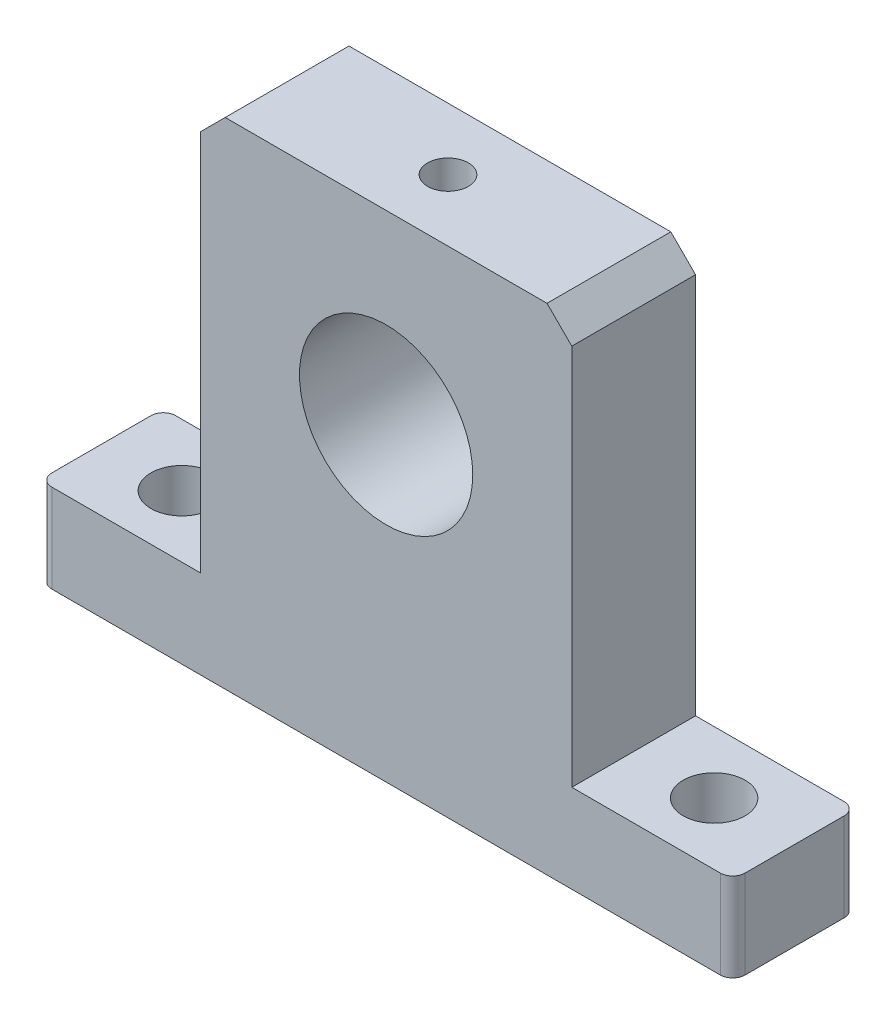
ISO-10303-21;
HEADER;
FILE_DESCRIPTION(('STEP AP214'),'2;1');
FILE_NAME('part.step','',(''),(''),'','','');
FILE_SCHEMA(('AUTOMOTIVE_DESIGN { 1 0 10303 214 1 1 1 1 }'));
ENDSEC;
DATA;
#1=APPLICATION_CONTEXT('core data for automotive mechanical design processes');
#2=APPLICATION_PROTOCOL_DEFINITION('international standard','automotive_design',2000,#1);
#3=PRODUCT_CONTEXT('',#1,'mechanical');
#4=PRODUCT('Part','Part','',(#3));
#5=PRODUCT_RELATED_PRODUCT_CATEGORY('part','',(#4));
#6=PRODUCT_DEFINITION_FORMATION('','',#4);
#7=PRODUCT_DEFINITION_CONTEXT('part definition',#1,'design');
#8=PRODUCT_DEFINITION('design','',#6,#7);
#9=PRODUCT_DEFINITION_SHAPE('','',#8);
#10=(LENGTH_UNIT() NAMED_UNIT(*) SI_UNIT(.MILLI.,.METRE.));
#11=(NAMED_UNIT(*) PLANE_ANGLE_UNIT() SI_UNIT($,.RADIAN.));
#12=(NAMED_UNIT(*) SI_UNIT($,.STERADIAN.) SOLID_ANGLE_UNIT());
#13=UNCERTAINTY_MEASURE_WITH_UNIT(LENGTH_MEASURE(1.E-05),#10,'distance_accuracy_value','');
#14=(GEOMETRIC_REPRESENTATION_CONTEXT(3) GLOBAL_UNCERTAINTY_ASSIGNED_CONTEXT((#13)) GLOBAL_UNIT_ASSIGNED_CONTEXT((#10,
#11,#12)) REPRESENTATION_CONTEXT('',''));
#15=CARTESIAN_POINT('',(0.,0.,0.));
#16=DIRECTION('',(0.,0.,1.));
#17=DIRECTION('',(1.,0.,0.));
#18=AXIS2_PLACEMENT_3D('',#15,#16,#17);
#19=CARTESIAN_POINT('',(-38.590308370044,37.488986784141,0.));
#20=DIRECTION('',(-1.,0.,0.));
#21=DIRECTION('',(0.,0.,1.));
#22=AXIS2_PLACEMENT_3D('',#19,#20,#21);
#23=PLANE('',#22);
#24=DIRECTION('',(0.,0.,-1.));
#25=VECTOR('',#24,1.);
#26=CARTESIAN_POINT('',(-38.590308370044,4.62555066079294,10.));
#27=LINE('',#26,#25);
#28=CARTESIAN_POINT('',(-38.590308370044,4.62555066079294,9.));
#29=VERTEX_POINT('',#28);
#30=CARTESIAN_POINT('',(-38.590308370044,4.62555066079294,1.));
#31=VERTEX_POINT('',#30);
#32=EDGE_CURVE('E176',#29,#31,#27,.T.);
#33=ORIENTED_EDGE('',*,*,#32,.T.);
#34=DIRECTION('',(0.,-1.,0.));
#35=VECTOR('',#34,1.);
#36=CARTESIAN_POINT('',(-38.590308370044,-2.51101321585903,1.));
#37=LINE('',#36,#35);
#38=CARTESIAN_POINT('',(-38.590308370044,-2.51101321585903,1.));
#39=VERTEX_POINT('',#38);
#40=EDGE_CURVE('E237',#31,#39,#37,.T.);
#41=ORIENTED_EDGE('',*,*,#40,.T.);
#42=DIRECTION('',(0.,0.,1.));
#43=VECTOR('',#42,1.);
#44=CARTESIAN_POINT('',(-38.590308370044,-2.51101321585903,0.));
#45=LINE('',#44,#43);
#46=CARTESIAN_POINT('',(-38.590308370044,-2.51101321585903,9.));
#47=VERTEX_POINT('',#46);
#48=EDGE_CURVE('E188',#39,#47,#45,.T.);
#49=ORIENTED_EDGE('',*,*,#48,.T.);
#50=DIRECTION('',(0.,-1.,0.));
#51=VECTOR('',#50,1.);
#52=CARTESIAN_POINT('',(-38.590308370044,37.488986784141,9.));
#53=LINE('',#52,#51);
#54=EDGE_CURVE('E235',#47,#29,#53,.F.);
#55=ORIENTED_EDGE('',*,*,#54,.T.);
#56=EDGE_LOOP('',(#33,#41,#49,#55));
#57=FACE_BOUND('',#56,.T.);
#58=ADVANCED_FACE('F33',(#57),#23,.T.);
#59=CARTESIAN_POINT('',(17.409691629956,37.488986784141,0.));
#60=DIRECTION('',(0.,1.,0.));
#61=DIRECTION('',(-1.,0.,0.));
#62=AXIS2_PLACEMENT_3D('',#59,#60,#61);
#63=PLANE('',#62);
#64=CARTESIAN_POINT('',(-10.590308370044,37.488986784141,5.));
#65=DIRECTION('',(0.,1.,0.));
#66=DIRECTION('',(0.,0.,1.));
#67=AXIS2_PLACEMENT_3D('',#64,#65,#66);
#68=CIRCLE('',#67,1.64999999999998);
#69=CARTESIAN_POINT('',(-10.590308370044,37.488986784141,6.64999999999998));
#70=VERTEX_POINT('',#69);
#71=EDGE_CURVE('E461',#70,#70,#68,.T.);
#72=ORIENTED_EDGE('',*,*,#71,.F.);
#73=EDGE_LOOP('',(#72));
#74=FACE_BOUND('',#73,.T.);
#75=DIRECTION('',(-1.,0.,0.));
#76=VECTOR('',#75,1.);
#77=CARTESIAN_POINT('',(17.409691629956,37.488986784141,10.));
#78=LINE('',#77,#76);
#79=CARTESIAN_POINT('',(2.40969162995596,37.488986784141,10.));
#80=VERTEX_POINT('',#79);
#81=CARTESIAN_POINT('',(-23.590308370044,37.488986784141,10.));
#82=VERTEX_POINT('',#81);
#83=EDGE_CURVE('E185',#80,#82,#78,.T.);
#84=ORIENTED_EDGE('',*,*,#83,.F.);
#85=DIRECTION('',(0.,0.,-1.));
#86=VECTOR('',#85,1.);
#87=CARTESIAN_POINT('',(2.40969162995596,37.488986784141,0.));
#88=LINE('',#87,#86);
#89=CARTESIAN_POINT('',(2.40969162995596,37.488986784141,0.));
#90=VERTEX_POINT('',#89);
#91=EDGE_CURVE('E200',#80,#90,#88,.T.);
#92=ORIENTED_EDGE('',*,*,#91,.T.);
#93=DIRECTION('',(-1.,0.,0.));
#94=VECTOR('',#93,1.);
#95=CARTESIAN_POINT('',(17.409691629956,37.488986784141,0.));
#96=LINE('',#95,#94);
#97=CARTESIAN_POINT('',(-23.590308370044,37.488986784141,0.));
#98=VERTEX_POINT('',#97);
#99=EDGE_CURVE('E184',#90,#98,#96,.T.);
#100=ORIENTED_EDGE('',*,*,#99,.T.);
#101=DIRECTION('',(0.,0.,1.));
#102=VECTOR('',#101,1.);
#103=CARTESIAN_POINT('',(-23.590308370044,37.488986784141,10.));
#104=LINE('',#103,#102);
#105=EDGE_CURVE('E196',#98,#82,#104,.T.);
#106=ORIENTED_EDGE('',*,*,#105,.T.);
#107=EDGE_LOOP('',(#84,#92,#100,#106));
#108=FACE_BOUND('',#107,.T.);
#109=ADVANCED_FACE('F276',(#74,#108),#63,.T.);
#110=CARTESIAN_POINT('',(17.409691629956,-2.51101321585903,0.));
#111=DIRECTION('',(1.,0.,0.));
#112=DIRECTION('',(0.,1.,0.));
#113=AXIS2_PLACEMENT_3D('',#110,#111,#112);
#114=PLANE('',#113);
#115=DIRECTION('',(0.,0.,1.));
#116=VECTOR('',#115,1.);
#117=CARTESIAN_POINT('',(17.409691629956,-2.51101321585903,0.));
#118=LINE('',#117,#116);
#119=CARTESIAN_POINT('',(17.409691629956,-2.51101321585903,1.));
#120=VERTEX_POINT('',#119);
#121=CARTESIAN_POINT('',(17.409691629956,-2.51101321585903,9.));
#122=VERTEX_POINT('',#121);
#123=EDGE_CURVE('E193',#120,#122,#118,.T.);
#124=ORIENTED_EDGE('',*,*,#123,.F.);
#125=DIRECTION('',(0.,1.,0.));
#126=VECTOR('',#125,1.);
#127=CARTESIAN_POINT('',(17.409691629956,4.62555066079294,1.));
#128=LINE('',#127,#126);
#129=CARTESIAN_POINT('',(17.409691629956,4.62555066079294,1.));
#130=VERTEX_POINT('',#129);
#131=EDGE_CURVE('E217',#120,#130,#128,.T.);
#132=ORIENTED_EDGE('',*,*,#131,.T.);
#133=DIRECTION('',(0.,0.,-1.));
#134=VECTOR('',#133,1.);
#135=CARTESIAN_POINT('',(17.409691629956,4.62555066079294,10.));
#136=LINE('',#135,#134);
#137=CARTESIAN_POINT('',(17.409691629956,4.62555066079294,9.));
#138=VERTEX_POINT('',#137);
#139=EDGE_CURVE('E157',#138,#130,#136,.T.);
#140=ORIENTED_EDGE('',*,*,#139,.F.);
#141=DIRECTION('',(0.,1.,0.));
#142=VECTOR('',#141,1.);
#143=CARTESIAN_POINT('',(17.409691629956,-2.51101321585903,9.));
#144=LINE('',#143,#142);
#145=EDGE_CURVE('E215',#138,#122,#144,.F.);
#146=ORIENTED_EDGE('',*,*,#145,.T.);
#147=EDGE_LOOP('',(#124,#132,#140,#146));
#148=FACE_BOUND('',#147,.T.);
#149=ADVANCED_FACE('F258',(#148),#114,.T.);
#150=CARTESIAN_POINT('',(-38.590308370044,-2.51101321585903,0.));
#151=DIRECTION('',(0.,-1.,0.));
#152=DIRECTION('',(1.,0.,0.));
#153=AXIS2_PLACEMENT_3D('',#150,#151,#152);
#154=PLANE('',#153);
#155=CARTESIAN_POINT('',(-32.090308370044,-2.51101321585904,5.));
#156=DIRECTION('',(0.,1.,0.));
#157=DIRECTION('',(0.,0.,1.));
#158=AXIS2_PLACEMENT_3D('',#155,#156,#157);
#159=CIRCLE('',#158,2.49999999999998);
#160=CARTESIAN_POINT('',(-32.090308370044,-2.51101321585904,7.49999999999998));
#161=VERTEX_POINT('',#160);
#162=EDGE_CURVE('E488',#161,#161,#159,.T.);
#163=ORIENTED_EDGE('',*,*,#162,.T.);
#164=EDGE_LOOP('',(#163));
#165=FACE_BOUND('',#164,.T.);
#166=CARTESIAN_POINT('',(10.909691629956,-2.51101321585904,5.));
#167=DIRECTION('',(0.,1.,0.));
#168=DIRECTION('',(0.,0.,1.));
#169=AXIS2_PLACEMENT_3D('',#166,#167,#168);
#170=CIRCLE('',#169,2.49999999999998);
#171=CARTESIAN_POINT('',(10.909691629956,-2.51101321585904,7.49999999999998));
#172=VERTEX_POINT('',#171);
#173=EDGE_CURVE('E482',#172,#172,#170,.T.);
#174=ORIENTED_EDGE('',*,*,#173,.T.);
#175=EDGE_LOOP('',(#174));
#176=FACE_BOUND('',#175,.T.);
#177=DIRECTION('',(1.,0.,0.));
#178=VECTOR('',#177,1.);
#179=CARTESIAN_POINT('',(-38.590308370044,-2.51101321585903,0.));
#180=LINE('',#179,#178);
#181=CARTESIAN_POINT('',(-37.590308370044,-2.51101321585903,0.));
#182=VERTEX_POINT('',#181);
#183=CARTESIAN_POINT('',(16.409691629956,-2.51101321585903,0.));
#184=VERTEX_POINT('',#183);
#185=EDGE_CURVE('E181',#182,#184,#180,.T.);
#186=ORIENTED_EDGE('',*,*,#185,.T.);
#187=CARTESIAN_POINT('',(16.409691629956,-2.51101321585903,1.));
#188=DIRECTION('',(0.,-1.,0.));
#189=DIRECTION('',(1.,0.,0.));
#190=AXIS2_PLACEMENT_3D('',#187,#188,#189);
#191=CIRCLE('',#190,1.);
#192=EDGE_CURVE('E233',#184,#120,#191,.T.);
#193=ORIENTED_EDGE('',*,*,#192,.T.);
#194=ORIENTED_EDGE('',*,*,#123,.T.);
#195=CARTESIAN_POINT('',(16.409691629956,-2.51101321585903,9.));
#196=DIRECTION('',(0.,-1.,0.));
#197=DIRECTION('',(1.,0.,0.));
#198=AXIS2_PLACEMENT_3D('',#195,#196,#197);
#199=CIRCLE('',#198,1.);
#200=CARTESIAN_POINT('',(16.409691629956,-2.51101321585903,10.));
#201=VERTEX_POINT('',#200);
#202=EDGE_CURVE('E229',#122,#201,#199,.T.);
#203=ORIENTED_EDGE('',*,*,#202,.T.);
#204=DIRECTION('',(1.,0.,0.));
#205=VECTOR('',#204,1.);
#206=CARTESIAN_POINT('',(-38.590308370044,-2.51101321585903,10.));
#207=LINE('',#206,#205);
#208=CARTESIAN_POINT('',(-37.590308370044,-2.51101321585903,10.));
#209=VERTEX_POINT('',#208);
#210=EDGE_CURVE('E178',#209,#201,#207,.T.);
#211=ORIENTED_EDGE('',*,*,#210,.F.);
#212=CARTESIAN_POINT('',(-37.590308370044,-2.51101321585903,9.));
#213=DIRECTION('',(0.,-1.,0.));
#214=DIRECTION('',(1.,0.,0.));
#215=AXIS2_PLACEMENT_3D('',#212,#213,#214);
#216=CIRCLE('',#215,1.);
#217=EDGE_CURVE('E227',#209,#47,#216,.T.);
#218=ORIENTED_EDGE('',*,*,#217,.T.);
#219=ORIENTED_EDGE('',*,*,#48,.F.);
#220=CARTESIAN_POINT('',(-37.590308370044,-2.51101321585903,1.));
#221=DIRECTION('',(0.,-1.,0.));
#222=DIRECTION('',(1.,0.,0.));
#223=AXIS2_PLACEMENT_3D('',#220,#221,#222);
#224=CIRCLE('',#223,1.);
#225=EDGE_CURVE('E231',#39,#182,#224,.T.);
#226=ORIENTED_EDGE('',*,*,#225,.T.);
#227=EDGE_LOOP('',(#186,#193,#194,#203,#211,#218,#219,#226));
#228=FACE_BOUND('',#227,.T.);
#229=ADVANCED_FACE('F249',(#165,#176,#228),#154,.T.);
#230=CARTESIAN_POINT('',(0.,0.,0.));
#231=DIRECTION('',(0.,0.,1.));
#232=DIRECTION('',(1.,0.,0.));
#233=AXIS2_PLACEMENT_3D('',#230,#231,#232);
#234=PLANE('',#233);
#235=CARTESIAN_POINT('',(-10.590308370044,22.488986784141,0.));
#236=DIRECTION('',(0.,0.,1.));
#237=DIRECTION('',(1.,0.,0.));
#238=AXIS2_PLACEMENT_3D('',#235,#236,#237);
#239=CIRCLE('',#238,6.99999999999999);
#240=CARTESIAN_POINT('',(-3.59030837004405,22.488986784141,0.));
#241=VERTEX_POINT('',#240);
#242=EDGE_CURVE('E147',#241,#241,#239,.T.);
#243=ORIENTED_EDGE('',*,*,#242,.T.);
#244=EDGE_LOOP('',(#243));
#245=FACE_BOUND('',#244,.T.);
#246=DIRECTION('',(-1.,0.,0.));
#247=VECTOR('',#246,1.);
#248=CARTESIAN_POINT('',(17.409691629956,4.62555066079294,0.));
#249=LINE('',#248,#247);
#250=CARTESIAN_POINT('',(16.409691629956,4.62555066079294,0.));
#251=VERTEX_POINT('',#250);
#252=CARTESIAN_POINT('',(4.40969162995596,4.62555066079294,0.));
#253=VERTEX_POINT('',#252);
#254=EDGE_CURVE('E136',#251,#253,#249,.T.);
#255=ORIENTED_EDGE('',*,*,#254,.F.);
#256=DIRECTION('',(0.,1.,0.));
#257=VECTOR('',#256,1.);
#258=CARTESIAN_POINT('',(16.409691629956,-2.51101321585903,0.));
#259=LINE('',#258,#257);
#260=EDGE_CURVE('E225',#251,#184,#259,.F.);
#261=ORIENTED_EDGE('',*,*,#260,.T.);
#262=ORIENTED_EDGE('',*,*,#185,.F.);
#263=DIRECTION('',(0.,-1.,0.));
#264=VECTOR('',#263,1.);
#265=CARTESIAN_POINT('',(-37.590308370044,4.62555066079294,0.));
#266=LINE('',#265,#264);
#267=CARTESIAN_POINT('',(-37.590308370044,4.62555066079294,0.));
#268=VERTEX_POINT('',#267);
#269=EDGE_CURVE('E223',#182,#268,#266,.F.);
#270=ORIENTED_EDGE('',*,*,#269,.T.);
#271=DIRECTION('',(-1.,0.,0.));
#272=VECTOR('',#271,1.);
#273=CARTESIAN_POINT('',(-25.590308370044,4.62555066079294,0.));
#274=LINE('',#273,#272);
#275=CARTESIAN_POINT('',(-25.590308370044,4.62555066079294,0.));
#276=VERTEX_POINT('',#275);
#277=EDGE_CURVE('E171',#276,#268,#274,.T.);
#278=ORIENTED_EDGE('',*,*,#277,.F.);
#279=DIRECTION('',(0.,-1.,0.));
#280=VECTOR('',#279,1.);
#281=CARTESIAN_POINT('',(-25.590308370044,37.488986784141,0.));
#282=LINE('',#281,#280);
#283=CARTESIAN_POINT('',(-25.590308370044,35.488986784141,0.));
#284=VERTEX_POINT('',#283);
#285=EDGE_CURVE('E156',#284,#276,#282,.T.);
#286=ORIENTED_EDGE('',*,*,#285,.F.);
#287=DIRECTION('',(0.707106781186552,0.707106781186543,0.));
#288=VECTOR('',#287,1.);
#289=CARTESIAN_POINT('',(-25.590308370044,35.488986784141,0.));
#290=LINE('',#289,#288);
#291=EDGE_CURVE('E203',#284,#98,#290,.T.);
#292=ORIENTED_EDGE('',*,*,#291,.T.);
#293=ORIENTED_EDGE('',*,*,#99,.F.);
#294=DIRECTION('',(0.707106781186541,-0.707106781186554,0.));
#295=VECTOR('',#294,1.);
#296=CARTESIAN_POINT('',(2.40969162995596,37.488986784141,0.));
#297=LINE('',#296,#295);
#298=CARTESIAN_POINT('',(4.40969162995596,35.4889867841409,0.));
#299=VERTEX_POINT('',#298);
#300=EDGE_CURVE('E161',#90,#299,#297,.T.);
#301=ORIENTED_EDGE('',*,*,#300,.T.);
#302=DIRECTION('',(0.,1.,0.));
#303=VECTOR('',#302,1.);
#304=CARTESIAN_POINT('',(4.40969162995596,4.62555066079294,0.));
#305=LINE('',#304,#303);
#306=EDGE_CURVE('E146',#253,#299,#305,.T.);
#307=ORIENTED_EDGE('',*,*,#306,.F.);
#308=EDGE_LOOP('',(#255,#261,#262,#270,#278,#286,#292,#293,#301,#307));
#309=FACE_BOUND('',#308,.T.);
#310=ADVANCED_FACE('F159',(#245,#309),#234,.F.);
#311=CARTESIAN_POINT('',(0.,0.,10.));
#312=DIRECTION('',(0.,0.,1.));
#313=DIRECTION('',(1.,0.,0.));
#314=AXIS2_PLACEMENT_3D('',#311,#312,#313);
#315=PLANE('',#314);
#316=CARTESIAN_POINT('',(-10.590308370044,22.488986784141,10.));
#317=DIRECTION('',(0.,0.,1.));
#318=DIRECTION('',(1.,0.,0.));
#319=AXIS2_PLACEMENT_3D('',#316,#317,#318);
#320=CIRCLE('',#319,6.99999999999999);
#321=CARTESIAN_POINT('',(-3.59030837004405,22.488986784141,10.));
#322=VERTEX_POINT('',#321);
#323=EDGE_CURVE('E460',#322,#322,#320,.T.);
#324=ORIENTED_EDGE('',*,*,#323,.F.);
#325=EDGE_LOOP('',(#324));
#326=FACE_BOUND('',#325,.T.);
#327=ORIENTED_EDGE('',*,*,#210,.T.);
#328=DIRECTION('',(0.,1.,0.));
#329=VECTOR('',#328,1.);
#330=CARTESIAN_POINT('',(16.409691629956,0.,10.));
#331=LINE('',#330,#329);
#332=CARTESIAN_POINT('',(16.409691629956,4.62555066079294,10.));
#333=VERTEX_POINT('',#332);
#334=EDGE_CURVE('E11',#201,#333,#331,.T.);
#335=ORIENTED_EDGE('',*,*,#334,.T.);
#336=DIRECTION('',(-1.,0.,0.));
#337=VECTOR('',#336,1.);
#338=CARTESIAN_POINT('',(17.409691629956,4.62555066079294,10.));
#339=LINE('',#338,#337);
#340=CARTESIAN_POINT('',(4.40969162995596,4.62555066079294,10.));
#341=VERTEX_POINT('',#340);
#342=EDGE_CURVE('E162',#333,#341,#339,.T.);
#343=ORIENTED_EDGE('',*,*,#342,.T.);
#344=DIRECTION('',(0.,1.,0.));
#345=VECTOR('',#344,1.);
#346=CARTESIAN_POINT('',(4.40969162995596,4.62555066079294,10.));
#347=LINE('',#346,#345);
#348=CARTESIAN_POINT('',(4.40969162995596,35.4889867841409,10.));
#349=VERTEX_POINT('',#348);
#350=EDGE_CURVE('E155',#341,#349,#347,.T.);
#351=ORIENTED_EDGE('',*,*,#350,.T.);
#352=DIRECTION('',(-0.707106781186541,0.707106781186554,0.));
#353=VECTOR('',#352,1.);
#354=CARTESIAN_POINT('',(19.9493392070485,19.9493392070481,10.));
#355=LINE('',#354,#353);
#356=EDGE_CURVE('E210',#349,#80,#355,.T.);
#357=ORIENTED_EDGE('',*,*,#356,.T.);
#358=ORIENTED_EDGE('',*,*,#83,.T.);
#359=DIRECTION('',(-0.707106781186552,-0.707106781186543,0.));
#360=VECTOR('',#359,1.);
#361=CARTESIAN_POINT('',(-30.5396475770923,30.5396475770928,10.));
#362=LINE('',#361,#360);
#363=CARTESIAN_POINT('',(-25.590308370044,35.488986784141,10.));
#364=VERTEX_POINT('',#363);
#365=EDGE_CURVE('E208',#82,#364,#362,.T.);
#366=ORIENTED_EDGE('',*,*,#365,.T.);
#367=DIRECTION('',(0.,-1.,0.));
#368=VECTOR('',#367,1.);
#369=CARTESIAN_POINT('',(-25.590308370044,37.488986784141,10.));
#370=LINE('',#369,#368);
#371=CARTESIAN_POINT('',(-25.590308370044,4.62555066079294,10.));
#372=VERTEX_POINT('',#371);
#373=EDGE_CURVE('E168',#364,#372,#370,.T.);
#374=ORIENTED_EDGE('',*,*,#373,.T.);
#375=DIRECTION('',(-1.,0.,0.));
#376=VECTOR('',#375,1.);
#377=CARTESIAN_POINT('',(-25.590308370044,4.62555066079294,10.));
#378=LINE('',#377,#376);
#379=CARTESIAN_POINT('',(-37.590308370044,4.62555066079294,10.));
#380=VERTEX_POINT('',#379);
#381=EDGE_CURVE('E170',#372,#380,#378,.T.);
#382=ORIENTED_EDGE('',*,*,#381,.T.);
#383=DIRECTION('',(0.,-1.,0.));
#384=VECTOR('',#383,1.);
#385=CARTESIAN_POINT('',(-37.590308370044,0.,10.));
#386=LINE('',#385,#384);
#387=EDGE_CURVE('E41',#380,#209,#386,.T.);
#388=ORIENTED_EDGE('',*,*,#387,.T.);
#389=EDGE_LOOP('',(#327,#335,#343,#351,#357,#358,#366,#374,#382,#388));
#390=FACE_BOUND('',#389,.T.);
#391=ADVANCED_FACE('F245',(#326,#390),#315,.T.);
#392=CARTESIAN_POINT('',(-25.590308370044,4.62555066079294,10.));
#393=DIRECTION('',(0.,-1.,0.));
#394=DIRECTION('',(1.,0.,0.));
#395=AXIS2_PLACEMENT_3D('',#392,#393,#394);
#396=PLANE('',#395);
#397=CARTESIAN_POINT('',(-32.090308370044,4.62555066079294,5.));
#398=DIRECTION('',(0.,1.,0.));
#399=DIRECTION('',(0.,0.,1.));
#400=AXIS2_PLACEMENT_3D('',#397,#398,#399);
#401=CIRCLE('',#400,2.49999999999998);
#402=CARTESIAN_POINT('',(-32.090308370044,4.62555066079294,7.49999999999998));
#403=VERTEX_POINT('',#402);
#404=EDGE_CURVE('E491',#403,#403,#401,.T.);
#405=ORIENTED_EDGE('',*,*,#404,.F.);
#406=EDGE_LOOP('',(#405));
#407=FACE_BOUND('',#406,.T.);
#408=ORIENTED_EDGE('',*,*,#277,.T.);
#409=CARTESIAN_POINT('',(-37.590308370044,4.62555066079294,1.));
#410=DIRECTION('',(0.,-1.,0.));
#411=DIRECTION('',(1.,0.,0.));
#412=AXIS2_PLACEMENT_3D('',#409,#410,#411);
#413=CIRCLE('',#412,1.);
#414=EDGE_CURVE('E54',#268,#31,#413,.F.);
#415=ORIENTED_EDGE('',*,*,#414,.T.);
#416=ORIENTED_EDGE('',*,*,#32,.F.);
#417=CARTESIAN_POINT('',(-37.590308370044,4.62555066079294,9.));
#418=DIRECTION('',(0.,-1.,0.));
#419=DIRECTION('',(1.,0.,0.));
#420=AXIS2_PLACEMENT_3D('',#417,#418,#419);
#421=CIRCLE('',#420,1.);
#422=EDGE_CURVE('E48',#29,#380,#421,.F.);
#423=ORIENTED_EDGE('',*,*,#422,.T.);
#424=ORIENTED_EDGE('',*,*,#381,.F.);
#425=DIRECTION('',(0.,0.,-1.));
#426=VECTOR('',#425,1.);
#427=CARTESIAN_POINT('',(-25.590308370044,4.62555066079294,10.));
#428=LINE('',#427,#426);
#429=EDGE_CURVE('E173',#372,#276,#428,.T.);
#430=ORIENTED_EDGE('',*,*,#429,.T.);
#431=EDGE_LOOP('',(#408,#415,#416,#423,#424,#430));
#432=FACE_BOUND('',#431,.T.);
#433=ADVANCED_FACE('F270',(#407,#432),#396,.F.);
#434=CARTESIAN_POINT('',(-25.590308370044,37.488986784141,10.));
#435=DIRECTION('',(1.,0.,0.));
#436=DIRECTION('',(0.,0.,-1.));
#437=AXIS2_PLACEMENT_3D('',#434,#435,#436);
#438=PLANE('',#437);
#439=ORIENTED_EDGE('',*,*,#373,.F.);
#440=DIRECTION('',(0.,0.,-1.));
#441=VECTOR('',#440,1.);
#442=CARTESIAN_POINT('',(-25.590308370044,35.488986784141,0.));
#443=LINE('',#442,#441);
#444=EDGE_CURVE('E212',#364,#284,#443,.T.);
#445=ORIENTED_EDGE('',*,*,#444,.T.);
#446=ORIENTED_EDGE('',*,*,#285,.T.);
#447=ORIENTED_EDGE('',*,*,#429,.F.);
#448=EDGE_LOOP('',(#439,#445,#446,#447));
#449=FACE_BOUND('',#448,.T.);
#450=ADVANCED_FACE('F381',(#449),#438,.F.);
#451=CARTESIAN_POINT('',(4.40969162995596,4.62555066079294,10.));
#452=DIRECTION('',(-1.,0.,0.));
#453=DIRECTION('',(0.,0.,1.));
#454=AXIS2_PLACEMENT_3D('',#451,#452,#453);
#455=PLANE('',#454);
#456=ORIENTED_EDGE('',*,*,#306,.T.);
#457=DIRECTION('',(0.,0.,1.));
#458=VECTOR('',#457,1.);
#459=CARTESIAN_POINT('',(4.40969162995596,35.4889867841409,10.));
#460=LINE('',#459,#458);
#461=EDGE_CURVE('E206',#299,#349,#460,.T.);
#462=ORIENTED_EDGE('',*,*,#461,.T.);
#463=ORIENTED_EDGE('',*,*,#350,.F.);
#464=DIRECTION('',(0.,0.,-1.));
#465=VECTOR('',#464,1.);
#466=CARTESIAN_POINT('',(4.40969162995596,4.62555066079294,10.));
#467=LINE('',#466,#465);
#468=EDGE_CURVE('E141',#341,#253,#467,.T.);
#469=ORIENTED_EDGE('',*,*,#468,.T.);
#470=EDGE_LOOP('',(#456,#462,#463,#469));
#471=FACE_BOUND('',#470,.T.);
#472=ADVANCED_FACE('F152',(#471),#455,.F.);
#473=CARTESIAN_POINT('',(17.409691629956,4.62555066079294,10.));
#474=DIRECTION('',(0.,-1.,0.));
#475=DIRECTION('',(0.,0.,-1.));
#476=AXIS2_PLACEMENT_3D('',#473,#474,#475);
#477=PLANE('',#476);
#478=CARTESIAN_POINT('',(10.909691629956,4.62555066079295,5.));
#479=DIRECTION('',(0.,1.,0.));
#480=DIRECTION('',(0.,0.,1.));
#481=AXIS2_PLACEMENT_3D('',#478,#479,#480);
#482=CIRCLE('',#481,2.49999999999998);
#483=CARTESIAN_POINT('',(10.909691629956,4.62555066079295,7.49999999999998));
#484=VERTEX_POINT('',#483);
#485=EDGE_CURVE('E485',#484,#484,#482,.T.);
#486=ORIENTED_EDGE('',*,*,#485,.F.);
#487=EDGE_LOOP('',(#486));
#488=FACE_BOUND('',#487,.T.);
#489=ORIENTED_EDGE('',*,*,#139,.T.);
#490=CARTESIAN_POINT('',(16.409691629956,4.62555066079294,1.));
#491=DIRECTION('',(0.,-1.,0.));
#492=DIRECTION('',(0.,0.,-1.));
#493=AXIS2_PLACEMENT_3D('',#490,#491,#492);
#494=CIRCLE('',#493,1.);
#495=EDGE_CURVE('E142',#130,#251,#494,.F.);
#496=ORIENTED_EDGE('',*,*,#495,.T.);
#497=ORIENTED_EDGE('',*,*,#254,.T.);
#498=ORIENTED_EDGE('',*,*,#468,.F.);
#499=ORIENTED_EDGE('',*,*,#342,.F.);
#500=CARTESIAN_POINT('',(16.409691629956,4.62555066079294,9.));
#501=DIRECTION('',(0.,-1.,0.));
#502=DIRECTION('',(0.,0.,-1.));
#503=AXIS2_PLACEMENT_3D('',#500,#501,#502);
#504=CIRCLE('',#503,1.);
#505=EDGE_CURVE('E220',#333,#138,#504,.F.);
#506=ORIENTED_EDGE('',*,*,#505,.T.);
#507=EDGE_LOOP('',(#489,#496,#497,#498,#499,#506));
#508=FACE_BOUND('',#507,.T.);
#509=ADVANCED_FACE('F139',(#488,#508),#477,.F.);
#510=CARTESIAN_POINT('',(-10.590308370044,22.488986784141,10.));
#511=DIRECTION('',(0.,0.,1.));
#512=DIRECTION('',(1.,0.,0.));
#513=AXIS2_PLACEMENT_3D('',#510,#511,#512);
#514=CYLINDRICAL_SURFACE('',#513,6.99999999999999);
#515=CARTESIAN_POINT('',(-10.590308370044,29.488986784141,6.64999999999999));
#516=CARTESIAN_POINT('',(-10.4989796307264,29.4889851506135,6.64999715612091));
#517=CARTESIAN_POINT('',(-10.4076179527607,29.4871814626397,6.64239176915062));
#518=CARTESIAN_POINT('',(-10.2275020463797,29.4801606877936,6.61221009853047));
#519=CARTESIAN_POINT('',(-10.1387495150311,29.4749414285081,6.58962428672523));
#520=CARTESIAN_POINT('',(-9.96647989318809,29.4616689674517,6.53023822598252));
#521=CARTESIAN_POINT('',(-9.88295702122438,29.4536189626902,6.49345400799296));
#522=CARTESIAN_POINT('',(-9.72326916171565,29.4355477382468,6.40676915128464));
#523=CARTESIAN_POINT('',(-9.64710421878194,29.4255265066143,6.35686843304704));
#524=CARTESIAN_POINT('',(-9.50288693560185,29.404398599079,6.24439317834773));
#525=CARTESIAN_POINT('',(-9.43498982845627,29.3932766962772,6.18162244644473));
#526=CARTESIAN_POINT('',(-9.31058328730275,29.3713049592855,6.04560959082671));
#527=CARTESIAN_POINT('',(-9.25407500541043,29.3604551527185,5.97236640897827));
#528=CARTESIAN_POINT('',(-9.15334152385635,29.3401042240492,5.81630963254397));
#529=CARTESIAN_POINT('',(-9.10928600484101,29.3306225219092,5.73338374957659));
#530=CARTESIAN_POINT('',(-9.03579847853316,29.3143018375944,5.56104427829787));
#531=CARTESIAN_POINT('',(-9.00636441570635,29.3074624839791,5.47163160394848));
#532=CARTESIAN_POINT('',(-8.9634771171986,29.2973567410711,5.29055302796901));
#533=CARTESIAN_POINT('',(-8.94974674161321,29.2940284724992,5.19895629577561));
#534=CARTESIAN_POINT('',(-8.93779401546855,29.2911362316687,5.01470364633588));
#535=CARTESIAN_POINT('',(-8.93956943697445,29.2915717186186,4.92204788316596));
#536=CARTESIAN_POINT('',(-8.95835589235091,29.2961019704238,4.74040081920415));
#537=CARTESIAN_POINT('',(-8.9750406634005,29.3001183695829,4.65137352003668));
#538=CARTESIAN_POINT('',(-9.02265342260722,29.3112334811998,4.47741848048742));
#539=CARTESIAN_POINT('',(-9.05358232434713,29.3183323913604,4.392491003444));
#540=CARTESIAN_POINT('',(-9.12909350005793,29.33488707034,4.22825160294739));
#541=CARTESIAN_POINT('',(-9.17379748906951,29.3443637039152,4.14899783060348));
#542=CARTESIAN_POINT('',(-9.27550452924254,29.3645938018517,3.99899787905212));
#543=CARTESIAN_POINT('',(-9.33250951014827,29.3753474664308,3.9282530374163));
#544=CARTESIAN_POINT('',(-9.458907920811,29.397252909115,3.79540520230352));
#545=CARTESIAN_POINT('',(-9.52857769964998,29.4084078852048,3.73356537204604));
#546=CARTESIAN_POINT('',(-9.67742952135159,29.429613202783,3.62240035299907));
#547=CARTESIAN_POINT('',(-9.75661179477506,29.4396635174857,3.57307546763308));
#548=CARTESIAN_POINT('',(-9.92259067644545,29.4575684792147,3.48825897652053));
#549=CARTESIAN_POINT('',(-10.0094078369433,29.4654169457567,3.45280620132095));
#550=CARTESIAN_POINT('',(-10.1879946502267,29.4779885792516,3.39706844656343));
#551=CARTESIAN_POINT('',(-10.2797634607549,29.482712275915,3.3767808961225));
#552=CARTESIAN_POINT('',(-10.4633951711448,29.4884251557632,3.35234231566718));
#553=CARTESIAN_POINT('',(-10.5552077932838,29.4894973810025,3.3478324033013));
#554=CARTESIAN_POINT('',(-10.7382750555457,29.4880212242349,3.35409827636914));
#555=CARTESIAN_POINT('',(-10.8295297394124,29.4854731298232,3.36487284761623));
#556=CARTESIAN_POINT('',(-11.0076710230638,29.4770954840611,3.40110507923743));
#557=CARTESIAN_POINT('',(-11.0945989224651,29.4713089160135,3.42637051352433));
#558=CARTESIAN_POINT('',(-11.2629806461142,29.4571040182131,3.49065065087643));
#559=CARTESIAN_POINT('',(-11.3444339546928,29.4486854409639,3.52966664699562));
#560=CARTESIAN_POINT('',(-11.5010088689994,29.4299483966589,3.62106042208637));
#561=CARTESIAN_POINT('',(-11.5760069410417,29.419601436356,3.67364386057602));
#562=CARTESIAN_POINT('',(-11.7162428196031,29.3982061623921,3.79041331924252));
#563=CARTESIAN_POINT('',(-11.7814791363,29.3871577420412,3.8546011071611));
#564=CARTESIAN_POINT('',(-11.9017906659549,29.3653114508728,3.99441505530596));
#565=CARTESIAN_POINT('',(-11.9566155493383,29.354524169848,4.07025861259664));
#566=CARTESIAN_POINT('',(-12.0527548529802,29.3346912358256,4.23028479232452));
#567=CARTESIAN_POINT('',(-12.0940698772371,29.3256455049744,4.31446704173643));
#568=CARTESIAN_POINT('',(-12.1617191367317,29.3104141456079,4.48832127446083));
#569=CARTESIAN_POINT('',(-12.1881412385643,29.3042117829564,4.57795752685844));
#570=CARTESIAN_POINT('',(-12.2255001567895,29.2953458198624,4.76056565583676));
#571=CARTESIAN_POINT('',(-12.2364399194463,29.2926815461333,4.85353689432124));
#572=CARTESIAN_POINT('',(-12.2423828617239,29.291240611407,5.03764007583629));
#573=CARTESIAN_POINT('',(-12.2377845317359,29.2923667387464,5.12875861310138));
#574=CARTESIAN_POINT('',(-12.213683836823,29.2981572757544,5.30888236366682));
#575=CARTESIAN_POINT('',(-12.1941817097164,29.302821628964,5.39788761066537));
#576=CARTESIAN_POINT('',(-12.1410331461939,29.3151120131147,5.57088010606271));
#577=CARTESIAN_POINT('',(-12.1074535668314,29.3227240320435,5.6548889577515));
#578=CARTESIAN_POINT('',(-12.0271577686303,29.3400555610638,5.81613651147966));
#579=CARTESIAN_POINT('',(-11.9804399349485,29.3497753301885,5.89337437975523));
#580=CARTESIAN_POINT('',(-11.8739104154229,29.3705106260311,6.04083165170258));
#581=CARTESIAN_POINT('',(-11.8138186330314,29.3815510958817,6.11084523110531));
#582=CARTESIAN_POINT('',(-11.6828033053579,29.4035264380214,6.23992483888989));
#583=CARTESIAN_POINT('',(-11.6118772298699,29.4144612850077,6.29898830286589));
#584=CARTESIAN_POINT('',(-11.4598711042641,29.4351964813979,6.40538285532998));
#585=CARTESIAN_POINT('',(-11.3786498591847,29.4449764615871,6.45251645356405));
#586=CARTESIAN_POINT('',(-11.2092181411264,29.4620905421882,6.53238620957197));
#587=CARTESIAN_POINT('',(-11.1210131486456,29.4694265374285,6.56513352737678));
#588=CARTESIAN_POINT('',(-10.9590872548495,29.4796342933696,6.60997422050048));
#589=CARTESIAN_POINT('',(-10.8861903168829,29.4831185265131,6.62495329121563));
#590=CARTESIAN_POINT('',(-10.7389722614527,29.4877953688723,6.64496704386652));
#591=CARTESIAN_POINT('',(-10.6646512286279,29.4889881138549,6.65000231495694));
#592=CARTESIAN_POINT('',(-10.590308370044,29.488986784141,6.64999999999999));
#593=B_SPLINE_CURVE_WITH_KNOTS('',3,(#515,#516,#517,#518,#519,#520,#521,#522,#523,#524,#525,
#526,#527,#528,#529,#530,#531,#532,#533,#534,#535,#536,#537,#538,#539,#540,#541,#542,#543,#544,
#545,#546,#547,#548,#549,#550,#551,#552,#553,#554,#555,#556,#557,#558,#559,#560,#561,#562,#563,
#564,#565,#566,#567,#568,#569,#570,#571,#572,#573,#574,#575,#576,#577,#578,#579,#580,#581,#582,
#583,#584,#585,#586,#587,#588,#589,#590,#591,#592),.UNSPECIFIED.,.T.,.F.,(4,2,2,2,2,2,2,2,2,2,2,
2,2,2,2,2,2,2,2,2,2,2,2,2,2,2,2,2,2,2,2,2,2,2,2,2,2,2,4),(0.,0.273713930465043,
0.547602121208309,0.821181974218373,1.09476348584581,1.37287554367485,1.65101572175224,
1.93278083587445,2.21450632727551,2.49117922951625,2.76781237894393,3.03853628105217,
3.30927754913054,3.58248319512937,3.85573173204484,4.1358764900004,4.4160280393865,
4.69695826763978,4.97784086042079,5.25229133365966,5.52672000600242,5.79758981692423,
6.06848510628016,6.34375631656424,6.6190694955137,6.90033819981435,7.18159432744308,
7.46117322376548,7.74069890951605,8.01311084713947,8.28551843800222,8.55664670189883,
8.82780830516566,9.10529722607667,9.38285105021355,9.66473658497743,9.94640306170595,
10.1692231938146,10.3920301237803),.UNSPECIFIED.);
#594=CARTESIAN_POINT('',(-10.590308370044,29.488986784141,6.64999999999999));
#595=VERTEX_POINT('',#594);
#596=EDGE_CURVE('E454',#595,#595,#593,.T.);
#597=ORIENTED_EDGE('',*,*,#596,.T.);
#598=EDGE_LOOP('',(#597));
#599=FACE_BOUND('',#598,.T.);
#600=ORIENTED_EDGE('',*,*,#242,.F.);
#601=EDGE_LOOP('',(#600));
#602=FACE_BOUND('',#601,.T.);
#603=ORIENTED_EDGE('',*,*,#323,.T.);
#604=EDGE_LOOP('',(#603));
#605=FACE_BOUND('',#604,.T.);
#606=ADVANCED_FACE('F357',(#599,#602,#605),#514,.F.);
#607=CARTESIAN_POINT('',(-10.590308370044,37.488986784141,5.));
#608=DIRECTION('',(0.,1.,0.));
#609=DIRECTION('',(0.,0.,1.));
#610=AXIS2_PLACEMENT_3D('',#607,#608,#609);
#611=CYLINDRICAL_SURFACE('',#610,1.64999999999999);
#612=ORIENTED_EDGE('',*,*,#596,.F.);
#613=EDGE_LOOP('',(#612));
#614=FACE_BOUND('',#613,.T.);
#615=ORIENTED_EDGE('',*,*,#71,.T.);
#616=EDGE_LOOP('',(#615));
#617=FACE_BOUND('',#616,.T.);
#618=ADVANCED_FACE('F348',(#614,#617),#611,.F.);
#619=CARTESIAN_POINT('',(10.909691629956,4.62555066079295,5.));
#620=DIRECTION('',(0.,1.,0.));
#621=DIRECTION('',(0.,0.,1.));
#622=AXIS2_PLACEMENT_3D('',#619,#620,#621);
#623=CYLINDRICAL_SURFACE('',#622,2.49999999999998);
#624=ORIENTED_EDGE('',*,*,#173,.F.);
#625=EDGE_LOOP('',(#624));
#626=FACE_BOUND('',#625,.T.);
#627=ORIENTED_EDGE('',*,*,#485,.T.);
#628=EDGE_LOOP('',(#627));
#629=FACE_BOUND('',#628,.T.);
#630=ADVANCED_FACE('F338',(#626,#629),#623,.F.);
#631=CARTESIAN_POINT('',(-32.090308370044,4.62555066079294,5.));
#632=DIRECTION('',(0.,1.,0.));
#633=DIRECTION('',(0.,0.,1.));
#634=AXIS2_PLACEMENT_3D('',#631,#632,#633);
#635=CYLINDRICAL_SURFACE('',#634,2.49999999999998);
#636=ORIENTED_EDGE('',*,*,#162,.F.);
#637=EDGE_LOOP('',(#636));
#638=FACE_BOUND('',#637,.T.);
#639=ORIENTED_EDGE('',*,*,#404,.T.);
#640=EDGE_LOOP('',(#639));
#641=FACE_BOUND('',#640,.T.);
#642=ADVANCED_FACE('F290',(#638,#641),#635,.F.);
#643=CARTESIAN_POINT('',(2.40969162995596,37.488986784141,0.));
#644=DIRECTION('',(0.707106781186554,0.707106781186541,0.));
#645=DIRECTION('',(0.,0.,1.));
#646=AXIS2_PLACEMENT_3D('',#643,#644,#645);
#647=PLANE('',#646);
#648=ORIENTED_EDGE('',*,*,#356,.F.);
#649=ORIENTED_EDGE('',*,*,#461,.F.);
#650=ORIENTED_EDGE('',*,*,#300,.F.);
#651=ORIENTED_EDGE('',*,*,#91,.F.);
#652=EDGE_LOOP('',(#648,#649,#650,#651));
#653=FACE_BOUND('',#652,.T.);
#654=ADVANCED_FACE('F286',(#653),#647,.T.);
#655=CARTESIAN_POINT('',(-25.590308370044,35.488986784141,10.));
#656=DIRECTION('',(-0.707106781186542,0.707106781186552,0.));
#657=DIRECTION('',(0.,0.,1.));
#658=AXIS2_PLACEMENT_3D('',#655,#656,#657);
#659=PLANE('',#658);
#660=ORIENTED_EDGE('',*,*,#365,.F.);
#661=ORIENTED_EDGE('',*,*,#105,.F.);
#662=ORIENTED_EDGE('',*,*,#291,.F.);
#663=ORIENTED_EDGE('',*,*,#444,.F.);
#664=EDGE_LOOP('',(#660,#661,#662,#663));
#665=FACE_BOUND('',#664,.T.);
#666=ADVANCED_FACE('F289',(#665),#659,.T.);
#667=CARTESIAN_POINT('',(16.409691629956,-2.51101321585903,1.));
#668=DIRECTION('',(0.,-1.,0.));
#669=DIRECTION('',(1.,0.,0.));
#670=AXIS2_PLACEMENT_3D('',#667,#668,#669);
#671=CYLINDRICAL_SURFACE('',#670,1.);
#672=ORIENTED_EDGE('',*,*,#192,.F.);
#673=ORIENTED_EDGE('',*,*,#260,.F.);
#674=ORIENTED_EDGE('',*,*,#495,.F.);
#675=ORIENTED_EDGE('',*,*,#131,.F.);
#676=EDGE_LOOP('',(#672,#673,#674,#675));
#677=FACE_BOUND('',#676,.T.);
#678=ADVANCED_FACE('F262',(#677),#671,.T.);
#679=CARTESIAN_POINT('',(-37.590308370044,37.488986784141,1.));
#680=DIRECTION('',(0.,1.,0.));
#681=DIRECTION('',(0.,0.,1.));
#682=AXIS2_PLACEMENT_3D('',#679,#680,#681);
#683=CYLINDRICAL_SURFACE('',#682,1.);
#684=ORIENTED_EDGE('',*,*,#414,.F.);
#685=ORIENTED_EDGE('',*,*,#269,.F.);
#686=ORIENTED_EDGE('',*,*,#225,.F.);
#687=ORIENTED_EDGE('',*,*,#40,.F.);
#688=EDGE_LOOP('',(#684,#685,#686,#687));
#689=FACE_BOUND('',#688,.T.);
#690=ADVANCED_FACE('F267',(#689),#683,.T.);
#691=CARTESIAN_POINT('',(16.409691629956,0.,9.));
#692=DIRECTION('',(0.,1.,0.));
#693=DIRECTION('',(-1.,0.,0.));
#694=AXIS2_PLACEMENT_3D('',#691,#692,#693);
#695=CYLINDRICAL_SURFACE('',#694,1.);
#696=ORIENTED_EDGE('',*,*,#202,.F.);
#697=ORIENTED_EDGE('',*,*,#145,.F.);
#698=ORIENTED_EDGE('',*,*,#505,.F.);
#699=ORIENTED_EDGE('',*,*,#334,.F.);
#700=EDGE_LOOP('',(#696,#697,#698,#699));
#701=FACE_BOUND('',#700,.T.);
#702=ADVANCED_FACE('F255',(#701),#695,.T.);
#703=CARTESIAN_POINT('',(-37.590308370044,0.,9.));
#704=DIRECTION('',(0.,-1.,0.));
#705=DIRECTION('',(0.,0.,-1.));
#706=AXIS2_PLACEMENT_3D('',#703,#704,#705);
#707=CYLINDRICAL_SURFACE('',#706,1.);
#708=ORIENTED_EDGE('',*,*,#422,.F.);
#709=ORIENTED_EDGE('',*,*,#54,.F.);
#710=ORIENTED_EDGE('',*,*,#217,.F.);
#711=ORIENTED_EDGE('',*,*,#387,.F.);
#712=EDGE_LOOP('',(#708,#709,#710,#711));
#713=FACE_BOUND('',#712,.T.);
#714=ADVANCED_FACE('F35',(#713),#707,.T.);
#715=CLOSED_SHELL('',(#58,#109,#149,#229,#310,#391,#433,#450,#472,#509,#606,#618,#630,#642,#654,
#666,#678,#690,#702,#714));
#716=MANIFOLD_SOLID_BREP('B2',#715);
#717=ADVANCED_BREP_SHAPE_REPRESENTATION('',(#18,#716),#14);
#718=SHAPE_DEFINITION_REPRESENTATION(#9,#717);
ENDSEC;
END-ISO-10303-21;
